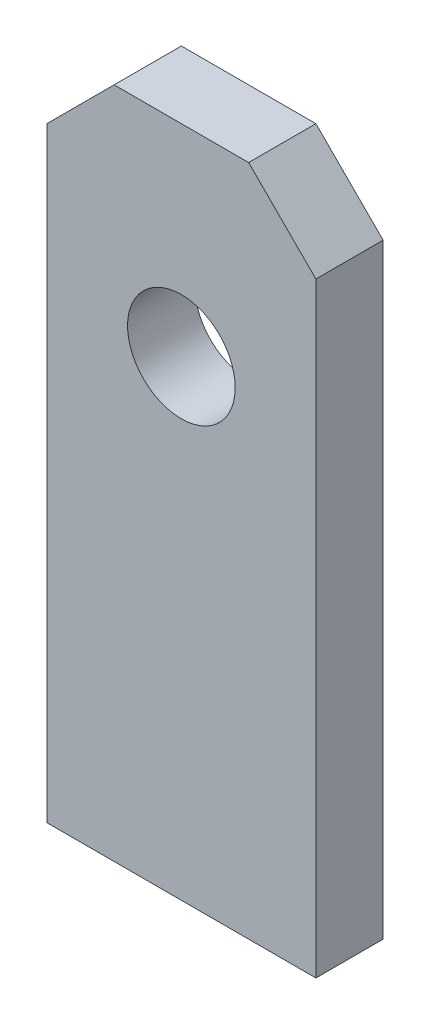
ISO-10303-21;
HEADER;
FILE_DESCRIPTION(('STEP AP214'),'2;1');
FILE_NAME('part.step','',(''),(''),'','','');
FILE_SCHEMA(('AUTOMOTIVE_DESIGN { 1 0 10303 214 1 1 1 1 }'));
ENDSEC;
DATA;
#1=APPLICATION_CONTEXT('core data for automotive mechanical design processes');
#2=APPLICATION_PROTOCOL_DEFINITION('international standard','automotive_design',2000,#1);
#3=PRODUCT_CONTEXT('',#1,'mechanical');
#4=PRODUCT('Part','Part','',(#3));
#5=PRODUCT_RELATED_PRODUCT_CATEGORY('part','',(#4));
#6=PRODUCT_DEFINITION_FORMATION('','',#4);
#7=PRODUCT_DEFINITION_CONTEXT('part definition',#1,'design');
#8=PRODUCT_DEFINITION('design','',#6,#7);
#9=PRODUCT_DEFINITION_SHAPE('','',#8);
#10=(LENGTH_UNIT() NAMED_UNIT(*) SI_UNIT(.MILLI.,.METRE.));
#11=(NAMED_UNIT(*) PLANE_ANGLE_UNIT() SI_UNIT($,.RADIAN.));
#12=(NAMED_UNIT(*) SI_UNIT($,.STERADIAN.) SOLID_ANGLE_UNIT());
#13=UNCERTAINTY_MEASURE_WITH_UNIT(LENGTH_MEASURE(1.E-05),#10,'distance_accuracy_value','');
#14=(GEOMETRIC_REPRESENTATION_CONTEXT(3) GLOBAL_UNCERTAINTY_ASSIGNED_CONTEXT((#13)) GLOBAL_UNIT_ASSIGNED_CONTEXT((#10,
#11,#12)) REPRESENTATION_CONTEXT('',''));
#15=CARTESIAN_POINT('',(0.,0.,0.));
#16=DIRECTION('',(0.,0.,1.));
#17=DIRECTION('',(1.,0.,0.));
#18=AXIS2_PLACEMENT_3D('',#15,#16,#17);
#19=CARTESIAN_POINT('',(20.,0.,10.));
#20=DIRECTION('',(0.,-1.,0.));
#21=DIRECTION('',(1.,0.,0.));
#22=AXIS2_PLACEMENT_3D('',#19,#20,#21);
#23=PLANE('',#22);
#24=DIRECTION('',(-1.,0.,0.));
#25=VECTOR('',#24,1.);
#26=CARTESIAN_POINT('',(20.,0.,0.));
#27=LINE('',#26,#25);
#28=CARTESIAN_POINT('',(20.,0.,0.));
#29=VERTEX_POINT('',#28);
#30=CARTESIAN_POINT('',(-20.,0.,0.));
#31=VERTEX_POINT('',#30);
#32=EDGE_CURVE('E120',#29,#31,#27,.T.);
#33=ORIENTED_EDGE('',*,*,#32,.F.);
#34=DIRECTION('',(0.,0.,-1.));
#35=VECTOR('',#34,1.);
#36=CARTESIAN_POINT('',(20.,0.,10.));
#37=LINE('',#36,#35);
#38=CARTESIAN_POINT('',(20.,0.,10.));
#39=VERTEX_POINT('',#38);
#40=EDGE_CURVE('E11',#39,#29,#37,.T.);
#41=ORIENTED_EDGE('',*,*,#40,.F.);
#42=DIRECTION('',(-1.,0.,0.));
#43=VECTOR('',#42,1.);
#44=CARTESIAN_POINT('',(20.,0.,10.));
#45=LINE('',#44,#43);
#46=CARTESIAN_POINT('',(-20.,0.,10.));
#47=VERTEX_POINT('',#46);
#48=EDGE_CURVE('E133',#39,#47,#45,.T.);
#49=ORIENTED_EDGE('',*,*,#48,.T.);
#50=DIRECTION('',(0.,0.,-1.));
#51=VECTOR('',#50,1.);
#52=CARTESIAN_POINT('',(-20.,0.,10.));
#53=LINE('',#52,#51);
#54=EDGE_CURVE('E36',#47,#31,#53,.T.);
#55=ORIENTED_EDGE('',*,*,#54,.T.);
#56=EDGE_LOOP('',(#33,#41,#49,#55));
#57=FACE_BOUND('',#56,.T.);
#58=ADVANCED_FACE('F33',(#57),#23,.T.);
#59=CARTESIAN_POINT('',(20.,0.,10.));
#60=DIRECTION('',(-1.,0.,0.));
#61=DIRECTION('',(0.,0.,1.));
#62=AXIS2_PLACEMENT_3D('',#59,#60,#61);
#63=PLANE('',#62);
#64=DIRECTION('',(0.,1.,0.));
#65=VECTOR('',#64,1.);
#66=CARTESIAN_POINT('',(20.,0.,0.));
#67=LINE('',#66,#65);
#68=CARTESIAN_POINT('',(20.,90.,0.));
#69=VERTEX_POINT('',#68);
#70=EDGE_CURVE('E72',#29,#69,#67,.T.);
#71=ORIENTED_EDGE('',*,*,#70,.T.);
#72=DIRECTION('',(0.,0.,-1.));
#73=VECTOR('',#72,1.);
#74=CARTESIAN_POINT('',(20.,90.,10.));
#75=LINE('',#74,#73);
#76=CARTESIAN_POINT('',(20.,90.,10.));
#77=VERTEX_POINT('',#76);
#78=EDGE_CURVE('E42',#77,#69,#75,.T.);
#79=ORIENTED_EDGE('',*,*,#78,.F.);
#80=DIRECTION('',(0.,1.,0.));
#81=VECTOR('',#80,1.);
#82=CARTESIAN_POINT('',(20.,0.,10.));
#83=LINE('',#82,#81);
#84=EDGE_CURVE('E99',#39,#77,#83,.T.);
#85=ORIENTED_EDGE('',*,*,#84,.F.);
#86=ORIENTED_EDGE('',*,*,#40,.T.);
#87=EDGE_LOOP('',(#71,#79,#85,#86));
#88=FACE_BOUND('',#87,.T.);
#89=ADVANCED_FACE('F166',(#88),#63,.F.);
#90=CARTESIAN_POINT('',(20.,90.,10.));
#91=DIRECTION('',(-0.707106781186547,-0.707106781186548,0.));
#92=DIRECTION('',(0.707106781186548,-0.707106781186547,0.));
#93=AXIS2_PLACEMENT_3D('',#90,#91,#92);
#94=PLANE('',#93);
#95=DIRECTION('',(-0.707106781186548,0.707106781186547,0.));
#96=VECTOR('',#95,1.);
#97=CARTESIAN_POINT('',(20.,90.,0.));
#98=LINE('',#97,#96);
#99=CARTESIAN_POINT('',(10.,100.,0.));
#100=VERTEX_POINT('',#99);
#101=EDGE_CURVE('E106',#69,#100,#98,.T.);
#102=ORIENTED_EDGE('',*,*,#101,.T.);
#103=DIRECTION('',(0.,0.,-1.));
#104=VECTOR('',#103,1.);
#105=CARTESIAN_POINT('',(10.,100.,10.));
#106=LINE('',#105,#104);
#107=CARTESIAN_POINT('',(10.,100.,10.));
#108=VERTEX_POINT('',#107);
#109=EDGE_CURVE('E103',#108,#100,#106,.T.);
#110=ORIENTED_EDGE('',*,*,#109,.F.);
#111=DIRECTION('',(-0.707106781186548,0.707106781186547,0.));
#112=VECTOR('',#111,1.);
#113=CARTESIAN_POINT('',(20.,90.,10.));
#114=LINE('',#113,#112);
#115=EDGE_CURVE('E91',#77,#108,#114,.T.);
#116=ORIENTED_EDGE('',*,*,#115,.F.);
#117=ORIENTED_EDGE('',*,*,#78,.T.);
#118=EDGE_LOOP('',(#102,#110,#116,#117));
#119=FACE_BOUND('',#118,.T.);
#120=ADVANCED_FACE('F104',(#119),#94,.F.);
#121=CARTESIAN_POINT('',(-10.,100.,10.));
#122=DIRECTION('',(0.,1.,0.));
#123=DIRECTION('',(-1.,0.,0.));
#124=AXIS2_PLACEMENT_3D('',#121,#122,#123);
#125=PLANE('',#124);
#126=DIRECTION('',(1.,0.,0.));
#127=VECTOR('',#126,1.);
#128=CARTESIAN_POINT('',(-10.,100.,0.));
#129=LINE('',#128,#127);
#130=CARTESIAN_POINT('',(-10.,100.,0.));
#131=VERTEX_POINT('',#130);
#132=EDGE_CURVE('E130',#131,#100,#129,.T.);
#133=ORIENTED_EDGE('',*,*,#132,.F.);
#134=DIRECTION('',(0.,0.,-1.));
#135=VECTOR('',#134,1.);
#136=CARTESIAN_POINT('',(-10.,100.,10.));
#137=LINE('',#136,#135);
#138=CARTESIAN_POINT('',(-10.,100.,10.));
#139=VERTEX_POINT('',#138);
#140=EDGE_CURVE('E110',#139,#131,#137,.T.);
#141=ORIENTED_EDGE('',*,*,#140,.F.);
#142=DIRECTION('',(1.,0.,0.));
#143=VECTOR('',#142,1.);
#144=CARTESIAN_POINT('',(-10.,100.,10.));
#145=LINE('',#144,#143);
#146=EDGE_CURVE('E97',#139,#108,#145,.T.);
#147=ORIENTED_EDGE('',*,*,#146,.T.);
#148=ORIENTED_EDGE('',*,*,#109,.T.);
#149=EDGE_LOOP('',(#133,#141,#147,#148));
#150=FACE_BOUND('',#149,.T.);
#151=ADVANCED_FACE('F112',(#150),#125,.T.);
#152=CARTESIAN_POINT('',(-20.,90.,10.));
#153=DIRECTION('',(-0.707106781186548,0.707106781186547,0.));
#154=DIRECTION('',(-0.707106781186547,-0.707106781186548,0.));
#155=AXIS2_PLACEMENT_3D('',#152,#153,#154);
#156=PLANE('',#155);
#157=DIRECTION('',(0.707106781186547,0.707106781186548,0.));
#158=VECTOR('',#157,1.);
#159=CARTESIAN_POINT('',(-20.,90.,0.));
#160=LINE('',#159,#158);
#161=CARTESIAN_POINT('',(-20.,90.,0.));
#162=VERTEX_POINT('',#161);
#163=EDGE_CURVE('E127',#162,#131,#160,.T.);
#164=ORIENTED_EDGE('',*,*,#163,.F.);
#165=DIRECTION('',(0.,0.,-1.));
#166=VECTOR('',#165,1.);
#167=CARTESIAN_POINT('',(-20.,90.,10.));
#168=LINE('',#167,#166);
#169=CARTESIAN_POINT('',(-20.,90.,10.));
#170=VERTEX_POINT('',#169);
#171=EDGE_CURVE('E136',#170,#162,#168,.T.);
#172=ORIENTED_EDGE('',*,*,#171,.F.);
#173=DIRECTION('',(0.707106781186547,0.707106781186548,0.));
#174=VECTOR('',#173,1.);
#175=CARTESIAN_POINT('',(-20.,90.,10.));
#176=LINE('',#175,#174);
#177=EDGE_CURVE('E113',#170,#139,#176,.T.);
#178=ORIENTED_EDGE('',*,*,#177,.T.);
#179=ORIENTED_EDGE('',*,*,#140,.T.);
#180=EDGE_LOOP('',(#164,#172,#178,#179));
#181=FACE_BOUND('',#180,.T.);
#182=ADVANCED_FACE('F142',(#181),#156,.T.);
#183=CARTESIAN_POINT('',(-20.,0.,10.));
#184=DIRECTION('',(-1.,0.,0.));
#185=DIRECTION('',(0.,0.,1.));
#186=AXIS2_PLACEMENT_3D('',#183,#184,#185);
#187=PLANE('',#186);
#188=DIRECTION('',(0.,1.,0.));
#189=VECTOR('',#188,1.);
#190=CARTESIAN_POINT('',(-20.,0.,0.));
#191=LINE('',#190,#189);
#192=EDGE_CURVE('E123',#31,#162,#191,.T.);
#193=ORIENTED_EDGE('',*,*,#192,.F.);
#194=ORIENTED_EDGE('',*,*,#54,.F.);
#195=DIRECTION('',(0.,1.,0.));
#196=VECTOR('',#195,1.);
#197=CARTESIAN_POINT('',(-20.,0.,10.));
#198=LINE('',#197,#196);
#199=EDGE_CURVE('E115',#47,#170,#198,.T.);
#200=ORIENTED_EDGE('',*,*,#199,.T.);
#201=ORIENTED_EDGE('',*,*,#171,.T.);
#202=EDGE_LOOP('',(#193,#194,#200,#201));
#203=FACE_BOUND('',#202,.T.);
#204=ADVANCED_FACE('F138',(#203),#187,.T.);
#205=CARTESIAN_POINT('',(0.,0.,10.));
#206=DIRECTION('',(0.,0.,-1.));
#207=DIRECTION('',(-1.,0.,0.));
#208=AXIS2_PLACEMENT_3D('',#205,#206,#207);
#209=PLANE('',#208);
#210=CARTESIAN_POINT('',(0.,70.,10.));
#211=DIRECTION('',(0.,0.,1.));
#212=DIRECTION('',(1.,0.,0.));
#213=AXIS2_PLACEMENT_3D('',#210,#211,#212);
#214=CIRCLE('',#213,8.00000000000001);
#215=CARTESIAN_POINT('',(8.00000000000001,70.,10.));
#216=VERTEX_POINT('',#215);
#217=EDGE_CURVE('E145',#216,#216,#214,.T.);
#218=ORIENTED_EDGE('',*,*,#217,.F.);
#219=EDGE_LOOP('',(#218));
#220=FACE_BOUND('',#219,.T.);
#221=ORIENTED_EDGE('',*,*,#48,.F.);
#222=ORIENTED_EDGE('',*,*,#84,.T.);
#223=ORIENTED_EDGE('',*,*,#115,.T.);
#224=ORIENTED_EDGE('',*,*,#146,.F.);
#225=ORIENTED_EDGE('',*,*,#177,.F.);
#226=ORIENTED_EDGE('',*,*,#199,.F.);
#227=EDGE_LOOP('',(#221,#222,#223,#224,#225,#226));
#228=FACE_BOUND('',#227,.T.);
#229=ADVANCED_FACE('F94',(#220,#228),#209,.F.);
#230=CARTESIAN_POINT('',(0.,0.,0.));
#231=DIRECTION('',(0.,0.,-1.));
#232=DIRECTION('',(-1.,0.,0.));
#233=AXIS2_PLACEMENT_3D('',#230,#231,#232);
#234=PLANE('',#233);
#235=CARTESIAN_POINT('',(0.,70.,0.));
#236=DIRECTION('',(0.,0.,1.));
#237=DIRECTION('',(1.,0.,0.));
#238=AXIS2_PLACEMENT_3D('',#235,#236,#237);
#239=CIRCLE('',#238,8.00000000000001);
#240=CARTESIAN_POINT('',(8.00000000000001,70.,0.));
#241=VERTEX_POINT('',#240);
#242=EDGE_CURVE('E124',#241,#241,#239,.T.);
#243=ORIENTED_EDGE('',*,*,#242,.T.);
#244=EDGE_LOOP('',(#243));
#245=FACE_BOUND('',#244,.T.);
#246=ORIENTED_EDGE('',*,*,#32,.T.);
#247=ORIENTED_EDGE('',*,*,#192,.T.);
#248=ORIENTED_EDGE('',*,*,#163,.T.);
#249=ORIENTED_EDGE('',*,*,#132,.T.);
#250=ORIENTED_EDGE('',*,*,#101,.F.);
#251=ORIENTED_EDGE('',*,*,#70,.F.);
#252=EDGE_LOOP('',(#246,#247,#248,#249,#250,#251));
#253=FACE_BOUND('',#252,.T.);
#254=ADVANCED_FACE('F140',(#245,#253),#234,.T.);
#255=CARTESIAN_POINT('',(0.,70.,0.));
#256=DIRECTION('',(0.,0.,1.));
#257=DIRECTION('',(1.,0.,0.));
#258=AXIS2_PLACEMENT_3D('',#255,#256,#257);
#259=CYLINDRICAL_SURFACE('',#258,8.00000000000001);
#260=ORIENTED_EDGE('',*,*,#242,.F.);
#261=EDGE_LOOP('',(#260));
#262=FACE_BOUND('',#261,.T.);
#263=ORIENTED_EDGE('',*,*,#217,.T.);
#264=EDGE_LOOP('',(#263));
#265=FACE_BOUND('',#264,.T.);
#266=ADVANCED_FACE('F152',(#262,#265),#259,.F.);
#267=CLOSED_SHELL('',(#58,#89,#120,#151,#182,#204,#229,#254,#266));
#268=MANIFOLD_SOLID_BREP('B2',#267);
#269=ADVANCED_BREP_SHAPE_REPRESENTATION('',(#18,#268),#14);
#270=SHAPE_DEFINITION_REPRESENTATION(#9,#269);
ENDSEC;
END-ISO-10303-21;
